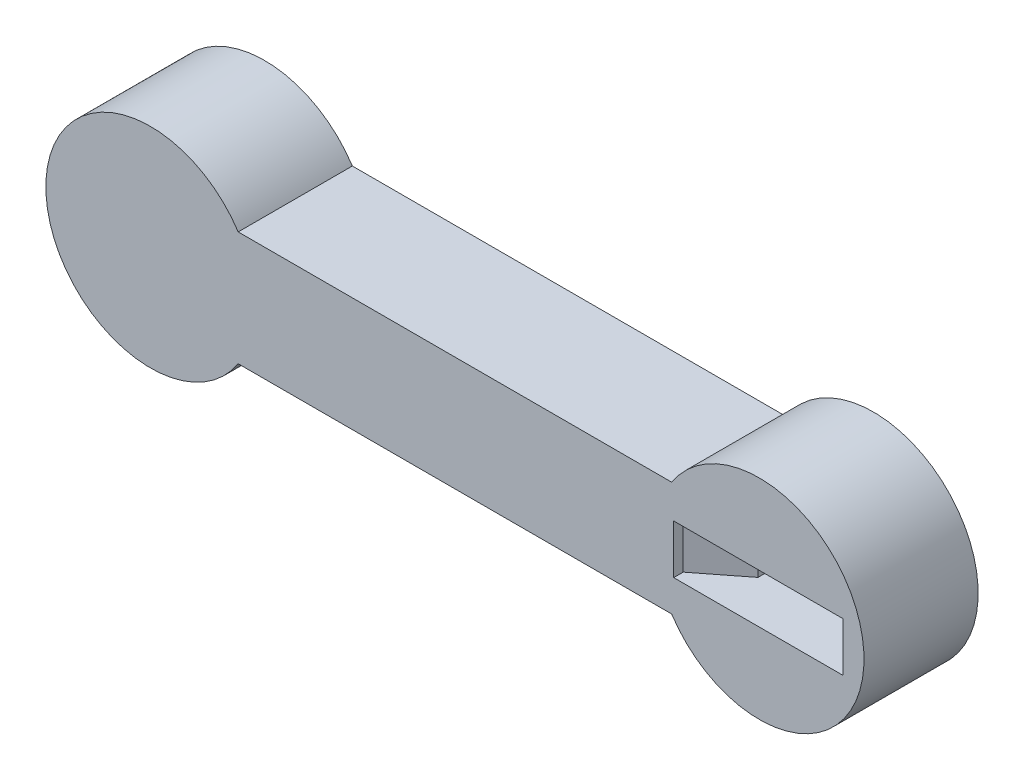
ISO-10303-21;
HEADER;
FILE_DESCRIPTION(('STEP AP214'),'2;1');
FILE_NAME('part.step','',(''),(''),'','','');
FILE_SCHEMA(('AUTOMOTIVE_DESIGN { 1 0 10303 214 1 1 1 1 }'));
ENDSEC;
DATA;
#1=APPLICATION_CONTEXT('core data for automotive mechanical design processes');
#2=APPLICATION_PROTOCOL_DEFINITION('international standard','automotive_design',2000,#1);
#3=PRODUCT_CONTEXT('',#1,'mechanical');
#4=PRODUCT('Part','Part','',(#3));
#5=PRODUCT_RELATED_PRODUCT_CATEGORY('part','',(#4));
#6=PRODUCT_DEFINITION_FORMATION('','',#4);
#7=PRODUCT_DEFINITION_CONTEXT('part definition',#1,'design');
#8=PRODUCT_DEFINITION('design','',#6,#7);
#9=PRODUCT_DEFINITION_SHAPE('','',#8);
#10=(LENGTH_UNIT() NAMED_UNIT(*) SI_UNIT(.MILLI.,.METRE.));
#11=(NAMED_UNIT(*) PLANE_ANGLE_UNIT() SI_UNIT($,.RADIAN.));
#12=(NAMED_UNIT(*) SI_UNIT($,.STERADIAN.) SOLID_ANGLE_UNIT());
#13=UNCERTAINTY_MEASURE_WITH_UNIT(LENGTH_MEASURE(1.E-05),#10,'distance_accuracy_value','');
#14=(GEOMETRIC_REPRESENTATION_CONTEXT(3) GLOBAL_UNCERTAINTY_ASSIGNED_CONTEXT((#13)) GLOBAL_UNIT_ASSIGNED_CONTEXT((#10,
#11,#12)) REPRESENTATION_CONTEXT('',''));
#15=CARTESIAN_POINT('',(0.,0.,0.));
#16=DIRECTION('',(0.,0.,1.));
#17=DIRECTION('',(1.,0.,0.));
#18=AXIS2_PLACEMENT_3D('',#15,#16,#17);
#19=CARTESIAN_POINT('',(0.,0.,30.));
#20=DIRECTION('',(0.,0.,1.));
#21=DIRECTION('',(1.,0.,0.));
#22=AXIS2_PLACEMENT_3D('',#19,#20,#21);
#23=PLANE('',#22);
#24=DIRECTION('',(-1.,0.,0.));
#25=VECTOR('',#24,1.);
#26=CARTESIAN_POINT('',(0.,6.45000000000005,30.));
#27=LINE('',#26,#25);
#28=CARTESIAN_POINT('',(181.919342789878,6.45000000000005,30.));
#29=VERTEX_POINT('',#28);
#30=CARTESIAN_POINT('',(137.49791436977,6.45,30.));
#31=VERTEX_POINT('',#30);
#32=EDGE_CURVE('E182',#29,#31,#27,.T.);
#33=ORIENTED_EDGE('',*,*,#32,.F.);
#34=DIRECTION('',(0.,-1.,0.));
#35=VECTOR('',#34,1.);
#36=CARTESIAN_POINT('',(181.919342789878,6.45000000000005,30.));
#37=LINE('',#36,#35);
#38=CARTESIAN_POINT('',(181.919342789878,-6.44999999999995,30.));
#39=VERTEX_POINT('',#38);
#40=EDGE_CURVE('E189',#29,#39,#37,.T.);
#41=ORIENTED_EDGE('',*,*,#40,.T.);
#42=DIRECTION('',(1.,0.,0.));
#43=VECTOR('',#42,1.);
#44=CARTESIAN_POINT('',(0.,-6.44999999999995,30.));
#45=LINE('',#44,#43);
#46=CARTESIAN_POINT('',(137.49791436977,-6.45,30.));
#47=VERTEX_POINT('',#46);
#48=EDGE_CURVE('E168',#47,#39,#45,.T.);
#49=ORIENTED_EDGE('',*,*,#48,.F.);
#50=DIRECTION('',(0.,-1.,0.));
#51=VECTOR('',#50,1.);
#52=CARTESIAN_POINT('',(137.49791436977,6.45,30.));
#53=LINE('',#52,#51);
#54=EDGE_CURVE('E229',#31,#47,#53,.T.);
#55=ORIENTED_EDGE('',*,*,#54,.F.);
#56=EDGE_LOOP('',(#33,#41,#49,#55));
#57=FACE_BOUND('',#56,.T.);
#58=CARTESIAN_POINT('',(0.,0.,30.));
#59=DIRECTION('',(0.,0.,1.));
#60=DIRECTION('',(1.,0.,0.));
#61=AXIS2_PLACEMENT_3D('',#58,#59,#60);
#62=CIRCLE('',#61,27.5);
#63=CARTESIAN_POINT('',(23.0488611432322,15.,30.));
#64=VERTEX_POINT('',#63);
#65=CARTESIAN_POINT('',(23.0488611432322,-15.,30.));
#66=VERTEX_POINT('',#65);
#67=EDGE_CURVE('E279',#64,#66,#62,.T.);
#68=ORIENTED_EDGE('',*,*,#67,.T.);
#69=DIRECTION('',(1.,0.,0.));
#70=VECTOR('',#69,1.);
#71=CARTESIAN_POINT('',(0.,-15.,30.));
#72=LINE('',#71,#70);
#73=CARTESIAN_POINT('',(136.951138856768,-15.,30.));
#74=VERTEX_POINT('',#73);
#75=EDGE_CURVE('E282',#66,#74,#72,.T.);
#76=ORIENTED_EDGE('',*,*,#75,.T.);
#77=CARTESIAN_POINT('',(160.,0.,30.));
#78=DIRECTION('',(0.,0.,1.));
#79=DIRECTION('',(1.,0.,0.));
#80=AXIS2_PLACEMENT_3D('',#77,#78,#79);
#81=CIRCLE('',#80,27.5);
#82=CARTESIAN_POINT('',(136.951138856768,15.,30.));
#83=VERTEX_POINT('',#82);
#84=EDGE_CURVE('E285',#74,#83,#81,.T.);
#85=ORIENTED_EDGE('',*,*,#84,.T.);
#86=DIRECTION('',(1.,0.,0.));
#87=VECTOR('',#86,1.);
#88=CARTESIAN_POINT('',(0.,15.,30.));
#89=LINE('',#88,#87);
#90=EDGE_CURVE('E287',#64,#83,#89,.T.);
#91=ORIENTED_EDGE('',*,*,#90,.F.);
#92=EDGE_LOOP('',(#68,#76,#85,#91));
#93=FACE_BOUND('',#92,.T.);
#94=ADVANCED_FACE('F43',(#57,#93),#23,.T.);
#95=CARTESIAN_POINT('',(0.,0.,4.5));
#96=DIRECTION('',(0.,0.,-1.));
#97=DIRECTION('',(-1.,0.,0.));
#98=AXIS2_PLACEMENT_3D('',#95,#96,#97);
#99=PLANE('',#98);
#100=CARTESIAN_POINT('',(151.719342789879,-8.88455975456281E-13,4.5));
#101=DIRECTION('',(0.,0.,-1.));
#102=DIRECTION('',(-1.,0.,0.));
#103=AXIS2_PLACEMENT_3D('',#100,#101,#102);
#104=CIRCLE('',#103,1.09999999999999);
#105=CARTESIAN_POINT('',(150.619342789879,-8.88455975456281E-13,4.5));
#106=VERTEX_POINT('',#105);
#107=EDGE_CURVE('E200',#106,#106,#104,.T.);
#108=ORIENTED_EDGE('',*,*,#107,.F.);
#109=EDGE_LOOP('',(#108));
#110=FACE_BOUND('',#109,.T.);
#111=DIRECTION('',(1.,0.,0.));
#112=VECTOR('',#111,1.);
#113=CARTESIAN_POINT('',(148.519342789878,6.45000000000005,4.5));
#114=LINE('',#113,#112);
#115=CARTESIAN_POINT('',(148.519342789878,6.45000000000005,4.5));
#116=VERTEX_POINT('',#115);
#117=CARTESIAN_POINT('',(153.497914369771,6.45000000000005,4.5));
#118=VERTEX_POINT('',#117);
#119=EDGE_CURVE('E250',#116,#118,#114,.T.);
#120=ORIENTED_EDGE('',*,*,#119,.T.);
#121=DIRECTION('',(0.,-1.,0.));
#122=VECTOR('',#121,1.);
#123=CARTESIAN_POINT('',(153.497914369771,0.,4.5));
#124=LINE('',#123,#122);
#125=CARTESIAN_POINT('',(153.497914369771,-6.44999999999995,4.5));
#126=VERTEX_POINT('',#125);
#127=EDGE_CURVE('E312',#118,#126,#124,.T.);
#128=ORIENTED_EDGE('',*,*,#127,.T.);
#129=DIRECTION('',(-1.,0.,0.));
#130=VECTOR('',#129,1.);
#131=CARTESIAN_POINT('',(148.519342789878,-6.44999999999995,4.5));
#132=LINE('',#131,#130);
#133=CARTESIAN_POINT('',(148.519342789878,-6.44999999999995,4.5));
#134=VERTEX_POINT('',#133);
#135=EDGE_CURVE('E256',#126,#134,#132,.T.);
#136=ORIENTED_EDGE('',*,*,#135,.T.);
#137=DIRECTION('',(0.,1.,0.));
#138=VECTOR('',#137,1.);
#139=CARTESIAN_POINT('',(148.519342789878,-6.44999999999995,4.5));
#140=LINE('',#139,#138);
#141=EDGE_CURVE('E245',#134,#116,#140,.T.);
#142=ORIENTED_EDGE('',*,*,#141,.T.);
#143=EDGE_LOOP('',(#120,#128,#136,#142));
#144=FACE_BOUND('',#143,.T.);
#145=ADVANCED_FACE('F333',(#110,#144),#99,.T.);
#146=CARTESIAN_POINT('',(0.,0.,30.));
#147=DIRECTION('',(0.,0.,-1.));
#148=DIRECTION('',(-1.,0.,0.));
#149=AXIS2_PLACEMENT_3D('',#146,#147,#148);
#150=CYLINDRICAL_SURFACE('',#149,27.5);
#151=CARTESIAN_POINT('',(0.,0.,0.));
#152=DIRECTION('',(0.,0.,1.));
#153=DIRECTION('',(1.,0.,0.));
#154=AXIS2_PLACEMENT_3D('',#151,#152,#153);
#155=CIRCLE('',#154,27.5);
#156=CARTESIAN_POINT('',(23.0488611432322,15.,0.));
#157=VERTEX_POINT('',#156);
#158=CARTESIAN_POINT('',(23.0488611432322,-15.,0.));
#159=VERTEX_POINT('',#158);
#160=EDGE_CURVE('E271',#157,#159,#155,.T.);
#161=ORIENTED_EDGE('',*,*,#160,.T.);
#162=DIRECTION('',(0.,0.,-1.));
#163=VECTOR('',#162,1.);
#164=CARTESIAN_POINT('',(23.0488611432322,-15.,30.));
#165=LINE('',#164,#163);
#166=EDGE_CURVE('E306',#66,#159,#165,.T.);
#167=ORIENTED_EDGE('',*,*,#166,.F.);
#168=ORIENTED_EDGE('',*,*,#67,.F.);
#169=DIRECTION('',(0.,0.,-1.));
#170=VECTOR('',#169,1.);
#171=CARTESIAN_POINT('',(23.0488611432322,15.,30.));
#172=LINE('',#171,#170);
#173=EDGE_CURVE('E290',#64,#157,#172,.T.);
#174=ORIENTED_EDGE('',*,*,#173,.T.);
#175=EDGE_LOOP('',(#161,#167,#168,#174));
#176=FACE_BOUND('',#175,.T.);
#177=ADVANCED_FACE('F45',(#176),#150,.T.);
#178=CARTESIAN_POINT('',(0.,-15.,30.));
#179=DIRECTION('',(0.,1.,0.));
#180=DIRECTION('',(-1.,0.,0.));
#181=AXIS2_PLACEMENT_3D('',#178,#179,#180);
#182=PLANE('',#181);
#183=DIRECTION('',(1.,0.,0.));
#184=VECTOR('',#183,1.);
#185=CARTESIAN_POINT('',(0.,-15.,0.));
#186=LINE('',#185,#184);
#187=CARTESIAN_POINT('',(136.951138856768,-15.,0.));
#188=VERTEX_POINT('',#187);
#189=EDGE_CURVE('E293',#159,#188,#186,.T.);
#190=ORIENTED_EDGE('',*,*,#189,.T.);
#191=DIRECTION('',(0.,0.,-1.));
#192=VECTOR('',#191,1.);
#193=CARTESIAN_POINT('',(136.951138856768,-15.,30.));
#194=LINE('',#193,#192);
#195=EDGE_CURVE('E303',#74,#188,#194,.T.);
#196=ORIENTED_EDGE('',*,*,#195,.F.);
#197=ORIENTED_EDGE('',*,*,#75,.F.);
#198=ORIENTED_EDGE('',*,*,#166,.T.);
#199=EDGE_LOOP('',(#190,#196,#197,#198));
#200=FACE_BOUND('',#199,.T.);
#201=ADVANCED_FACE('F404',(#200),#182,.F.);
#202=CARTESIAN_POINT('',(160.,0.,30.));
#203=DIRECTION('',(0.,0.,-1.));
#204=DIRECTION('',(-1.,0.,0.));
#205=AXIS2_PLACEMENT_3D('',#202,#203,#204);
#206=CYLINDRICAL_SURFACE('',#205,27.5);
#207=CARTESIAN_POINT('',(160.,0.,0.));
#208=DIRECTION('',(0.,0.,1.));
#209=DIRECTION('',(1.,0.,0.));
#210=AXIS2_PLACEMENT_3D('',#207,#208,#209);
#211=CIRCLE('',#210,27.5);
#212=CARTESIAN_POINT('',(136.951138856768,15.,0.));
#213=VERTEX_POINT('',#212);
#214=EDGE_CURVE('E295',#188,#213,#211,.T.);
#215=ORIENTED_EDGE('',*,*,#214,.T.);
#216=DIRECTION('',(0.,0.,-1.));
#217=VECTOR('',#216,1.);
#218=CARTESIAN_POINT('',(136.951138856768,15.,30.));
#219=LINE('',#218,#217);
#220=EDGE_CURVE('E301',#83,#213,#219,.T.);
#221=ORIENTED_EDGE('',*,*,#220,.F.);
#222=ORIENTED_EDGE('',*,*,#84,.F.);
#223=ORIENTED_EDGE('',*,*,#195,.T.);
#224=EDGE_LOOP('',(#215,#221,#222,#223));
#225=FACE_BOUND('',#224,.T.);
#226=ADVANCED_FACE('F401',(#225),#206,.T.);
#227=CARTESIAN_POINT('',(0.,15.,30.));
#228=DIRECTION('',(0.,1.,0.));
#229=DIRECTION('',(0.,0.,1.));
#230=AXIS2_PLACEMENT_3D('',#227,#228,#229);
#231=PLANE('',#230);
#232=DIRECTION('',(1.,0.,0.));
#233=VECTOR('',#232,1.);
#234=CARTESIAN_POINT('',(0.,15.,0.));
#235=LINE('',#234,#233);
#236=EDGE_CURVE('E283',#157,#213,#235,.T.);
#237=ORIENTED_EDGE('',*,*,#236,.F.);
#238=ORIENTED_EDGE('',*,*,#173,.F.);
#239=ORIENTED_EDGE('',*,*,#90,.T.);
#240=ORIENTED_EDGE('',*,*,#220,.T.);
#241=EDGE_LOOP('',(#237,#238,#239,#240));
#242=FACE_BOUND('',#241,.T.);
#243=ADVANCED_FACE('F397',(#242),#231,.T.);
#244=CARTESIAN_POINT('',(0.,0.,0.));
#245=DIRECTION('',(0.,0.,1.));
#246=DIRECTION('',(1.,0.,0.));
#247=AXIS2_PLACEMENT_3D('',#244,#245,#246);
#248=PLANE('',#247);
#249=CARTESIAN_POINT('',(0.,0.,0.));
#250=DIRECTION('',(0.,0.,-1.));
#251=DIRECTION('',(-1.,0.,0.));
#252=AXIS2_PLACEMENT_3D('',#249,#250,#251);
#253=CIRCLE('',#252,20.0000000000004);
#254=CARTESIAN_POINT('',(-20.0000000000004,0.,0.));
#255=VERTEX_POINT('',#254);
#256=EDGE_CURVE('E216',#255,#255,#253,.T.);
#257=ORIENTED_EDGE('',*,*,#256,.F.);
#258=EDGE_LOOP('',(#257));
#259=FACE_BOUND('',#258,.T.);
#260=DIRECTION('',(1.,0.,0.));
#261=VECTOR('',#260,1.);
#262=CARTESIAN_POINT('',(148.519342789878,6.45000000000005,0.));
#263=LINE('',#262,#261);
#264=CARTESIAN_POINT('',(148.519342789878,6.45000000000005,0.));
#265=VERTEX_POINT('',#264);
#266=CARTESIAN_POINT('',(181.919342789878,6.45000000000005,0.));
#267=VERTEX_POINT('',#266);
#268=EDGE_CURVE('E262',#265,#267,#263,.T.);
#269=ORIENTED_EDGE('',*,*,#268,.F.);
#270=DIRECTION('',(0.,1.,0.));
#271=VECTOR('',#270,1.);
#272=CARTESIAN_POINT('',(148.519342789878,-6.44999999999995,0.));
#273=LINE('',#272,#271);
#274=CARTESIAN_POINT('',(148.519342789878,-6.44999999999995,0.));
#275=VERTEX_POINT('',#274);
#276=EDGE_CURVE('E239',#275,#265,#273,.T.);
#277=ORIENTED_EDGE('',*,*,#276,.F.);
#278=DIRECTION('',(-1.,0.,0.));
#279=VECTOR('',#278,1.);
#280=CARTESIAN_POINT('',(148.519342789878,-6.44999999999995,0.));
#281=LINE('',#280,#279);
#282=CARTESIAN_POINT('',(181.919342789878,-6.44999999999995,0.));
#283=VERTEX_POINT('',#282);
#284=EDGE_CURVE('E249',#283,#275,#281,.T.);
#285=ORIENTED_EDGE('',*,*,#284,.F.);
#286=DIRECTION('',(0.,-1.,0.));
#287=VECTOR('',#286,1.);
#288=CARTESIAN_POINT('',(181.919342789878,-6.44999999999995,0.));
#289=LINE('',#288,#287);
#290=EDGE_CURVE('E264',#267,#283,#289,.T.);
#291=ORIENTED_EDGE('',*,*,#290,.F.);
#292=EDGE_LOOP('',(#269,#277,#285,#291));
#293=FACE_BOUND('',#292,.T.);
#294=ORIENTED_EDGE('',*,*,#160,.F.);
#295=ORIENTED_EDGE('',*,*,#236,.T.);
#296=ORIENTED_EDGE('',*,*,#214,.F.);
#297=ORIENTED_EDGE('',*,*,#189,.F.);
#298=EDGE_LOOP('',(#294,#295,#296,#297));
#299=FACE_BOUND('',#298,.T.);
#300=ADVANCED_FACE('F358',(#259,#293,#299),#248,.F.);
#301=CARTESIAN_POINT('',(148.519342789878,-6.44999999999995,4.5));
#302=DIRECTION('',(-1.,0.,0.));
#303=DIRECTION('',(0.,0.,1.));
#304=AXIS2_PLACEMENT_3D('',#301,#302,#303);
#305=PLANE('',#304);
#306=ORIENTED_EDGE('',*,*,#276,.T.);
#307=DIRECTION('',(0.,0.,-1.));
#308=VECTOR('',#307,1.);
#309=CARTESIAN_POINT('',(148.519342789878,6.45000000000005,4.5));
#310=LINE('',#309,#308);
#311=EDGE_CURVE('E260',#116,#265,#310,.T.);
#312=ORIENTED_EDGE('',*,*,#311,.F.);
#313=ORIENTED_EDGE('',*,*,#141,.F.);
#314=DIRECTION('',(0.,0.,-1.));
#315=VECTOR('',#314,1.);
#316=CARTESIAN_POINT('',(148.519342789878,-6.44999999999995,4.5));
#317=LINE('',#316,#315);
#318=EDGE_CURVE('E268',#134,#275,#317,.T.);
#319=ORIENTED_EDGE('',*,*,#318,.T.);
#320=EDGE_LOOP('',(#306,#312,#313,#319));
#321=FACE_BOUND('',#320,.T.);
#322=ADVANCED_FACE('F356',(#321),#305,.F.);
#323=CARTESIAN_POINT('',(148.519342789878,-6.44999999999995,4.5));
#324=DIRECTION('',(0.,-1.,0.));
#325=DIRECTION('',(0.,0.,-1.));
#326=AXIS2_PLACEMENT_3D('',#323,#324,#325);
#327=PLANE('',#326);
#328=DIRECTION('',(0.,0.,-1.));
#329=VECTOR('',#328,1.);
#330=CARTESIAN_POINT('',(153.497914369771,-6.44999999999995,30.));
#331=LINE('',#330,#329);
#332=CARTESIAN_POINT('',(153.497914369771,-6.44999999999995,6.5));
#333=VERTEX_POINT('',#332);
#334=EDGE_CURVE('E237',#333,#126,#331,.T.);
#335=ORIENTED_EDGE('',*,*,#334,.F.);
#336=DIRECTION('',(-1.,0.,0.));
#337=VECTOR('',#336,1.);
#338=CARTESIAN_POINT('',(181.919342789878,-6.44999999999995,6.5));
#339=LINE('',#338,#337);
#340=CARTESIAN_POINT('',(148.519342789878,-6.44999999999995,6.5));
#341=VERTEX_POINT('',#340);
#342=EDGE_CURVE('E203',#333,#341,#339,.T.);
#343=ORIENTED_EDGE('',*,*,#342,.T.);
#344=DIRECTION('',(0.,0.,-1.));
#345=VECTOR('',#344,1.);
#346=CARTESIAN_POINT('',(148.519342789878,-6.44999999999995,30.));
#347=LINE('',#346,#345);
#348=CARTESIAN_POINT('',(148.519342789878,-6.45,18.8895090467903));
#349=VERTEX_POINT('',#348);
#350=EDGE_CURVE('E67',#349,#341,#347,.T.);
#351=ORIENTED_EDGE('',*,*,#350,.F.);
#352=DIRECTION('',(0.788024373724564,0.,-0.615644041972314));
#353=VECTOR('',#352,1.);
#354=CARTESIAN_POINT('',(65.4555466835088,-6.45,83.7830997548915));
#355=LINE('',#354,#353);
#356=CARTESIAN_POINT('',(137.49791436977,-6.45,27.5));
#357=VERTEX_POINT('',#356);
#358=EDGE_CURVE('E226',#357,#349,#355,.T.);
#359=ORIENTED_EDGE('',*,*,#358,.F.);
#360=DIRECTION('',(0.,0.,-1.));
#361=VECTOR('',#360,1.);
#362=CARTESIAN_POINT('',(137.49791436977,-6.45,-1.52653350371257E-12));
#363=LINE('',#362,#361);
#364=EDGE_CURVE('E176',#47,#357,#363,.T.);
#365=ORIENTED_EDGE('',*,*,#364,.F.);
#366=ORIENTED_EDGE('',*,*,#48,.T.);
#367=DIRECTION('',(0.,0.,-1.));
#368=VECTOR('',#367,1.);
#369=CARTESIAN_POINT('',(181.919342789878,-6.44999999999995,30.));
#370=LINE('',#369,#368);
#371=CARTESIAN_POINT('',(181.919342789878,-6.44999999999995,6.5));
#372=VERTEX_POINT('',#371);
#373=EDGE_CURVE('E173',#39,#372,#370,.T.);
#374=ORIENTED_EDGE('',*,*,#373,.T.);
#375=CARTESIAN_POINT('',(176.95,-6.44999999999995,6.5));
#376=VERTEX_POINT('',#375);
#377=EDGE_CURVE('E204',#372,#376,#339,.T.);
#378=ORIENTED_EDGE('',*,*,#377,.T.);
#379=DIRECTION('',(0.,0.,-1.));
#380=VECTOR('',#379,1.);
#381=CARTESIAN_POINT('',(176.95,-6.44999999999995,30.));
#382=LINE('',#381,#380);
#383=CARTESIAN_POINT('',(176.95,-6.44999999999995,4.5));
#384=VERTEX_POINT('',#383);
#385=EDGE_CURVE('E240',#376,#384,#382,.T.);
#386=ORIENTED_EDGE('',*,*,#385,.T.);
#387=CARTESIAN_POINT('',(181.919342789878,-6.44999999999995,4.5));
#388=VERTEX_POINT('',#387);
#389=EDGE_CURVE('E257',#388,#384,#132,.T.);
#390=ORIENTED_EDGE('',*,*,#389,.F.);
#391=DIRECTION('',(0.,0.,-1.));
#392=VECTOR('',#391,1.);
#393=CARTESIAN_POINT('',(181.919342789878,-6.44999999999995,4.5));
#394=LINE('',#393,#392);
#395=EDGE_CURVE('E272',#388,#283,#394,.T.);
#396=ORIENTED_EDGE('',*,*,#395,.T.);
#397=ORIENTED_EDGE('',*,*,#284,.T.);
#398=ORIENTED_EDGE('',*,*,#318,.F.);
#399=ORIENTED_EDGE('',*,*,#135,.F.);
#400=EDGE_LOOP('',(#335,#343,#351,#359,#365,#366,#374,#378,#386,#390,#396,#397,#398,#399));
#401=FACE_BOUND('',#400,.T.);
#402=ADVANCED_FACE('F171',(#401),#327,.F.);
#403=CARTESIAN_POINT('',(181.919342789878,-6.44999999999995,4.5));
#404=DIRECTION('',(1.,0.,0.));
#405=DIRECTION('',(0.,0.,-1.));
#406=AXIS2_PLACEMENT_3D('',#403,#404,#405);
#407=PLANE('',#406);
#408=ORIENTED_EDGE('',*,*,#290,.T.);
#409=ORIENTED_EDGE('',*,*,#395,.F.);
#410=DIRECTION('',(0.,-1.,0.));
#411=VECTOR('',#410,1.);
#412=CARTESIAN_POINT('',(181.919342789878,-6.44999999999995,4.5));
#413=LINE('',#412,#411);
#414=CARTESIAN_POINT('',(181.919342789878,6.45000000000005,4.5));
#415=VERTEX_POINT('',#414);
#416=EDGE_CURVE('E253',#415,#388,#413,.T.);
#417=ORIENTED_EDGE('',*,*,#416,.F.);
#418=DIRECTION('',(0.,0.,-1.));
#419=VECTOR('',#418,1.);
#420=CARTESIAN_POINT('',(181.919342789878,6.45000000000005,4.5));
#421=LINE('',#420,#419);
#422=EDGE_CURVE('E274',#415,#267,#421,.T.);
#423=ORIENTED_EDGE('',*,*,#422,.T.);
#424=EDGE_LOOP('',(#408,#409,#417,#423));
#425=FACE_BOUND('',#424,.T.);
#426=ADVANCED_FACE('F365',(#425),#407,.F.);
#427=CARTESIAN_POINT('',(148.519342789878,6.45000000000005,4.5));
#428=DIRECTION('',(0.,1.,0.));
#429=DIRECTION('',(0.,0.,1.));
#430=AXIS2_PLACEMENT_3D('',#427,#428,#429);
#431=PLANE('',#430);
#432=DIRECTION('',(0.,0.,-1.));
#433=VECTOR('',#432,1.);
#434=CARTESIAN_POINT('',(176.95,6.45000000000005,30.));
#435=LINE('',#434,#433);
#436=CARTESIAN_POINT('',(176.95,6.45000000000005,6.5));
#437=VERTEX_POINT('',#436);
#438=CARTESIAN_POINT('',(176.95,6.45000000000005,4.5));
#439=VERTEX_POINT('',#438);
#440=EDGE_CURVE('E242',#437,#439,#435,.T.);
#441=ORIENTED_EDGE('',*,*,#440,.F.);
#442=DIRECTION('',(1.,0.,0.));
#443=VECTOR('',#442,1.);
#444=CARTESIAN_POINT('',(181.919342789878,6.45000000000005,6.5));
#445=LINE('',#444,#443);
#446=CARTESIAN_POINT('',(181.919342789878,6.45000000000005,6.5));
#447=VERTEX_POINT('',#446);
#448=EDGE_CURVE('E60',#437,#447,#445,.T.);
#449=ORIENTED_EDGE('',*,*,#448,.T.);
#450=DIRECTION('',(0.,0.,-1.));
#451=VECTOR('',#450,1.);
#452=CARTESIAN_POINT('',(181.919342789878,6.45000000000005,30.));
#453=LINE('',#452,#451);
#454=EDGE_CURVE('E209',#29,#447,#453,.T.);
#455=ORIENTED_EDGE('',*,*,#454,.F.);
#456=ORIENTED_EDGE('',*,*,#32,.T.);
#457=DIRECTION('',(0.,0.,-1.));
#458=VECTOR('',#457,1.);
#459=CARTESIAN_POINT('',(137.49791436977,6.45,-1.52653350371257E-12));
#460=LINE('',#459,#458);
#461=CARTESIAN_POINT('',(137.49791436977,6.45,27.5));
#462=VERTEX_POINT('',#461);
#463=EDGE_CURVE('E222',#31,#462,#460,.T.);
#464=ORIENTED_EDGE('',*,*,#463,.T.);
#465=DIRECTION('',(0.788024373724564,0.,-0.615644041972314));
#466=VECTOR('',#465,1.);
#467=CARTESIAN_POINT('',(65.4555466835088,6.45,83.7830997548915));
#468=LINE('',#467,#466);
#469=CARTESIAN_POINT('',(148.519342789878,6.45000000000005,18.8895090467903));
#470=VERTEX_POINT('',#469);
#471=EDGE_CURVE('E225',#462,#470,#468,.T.);
#472=ORIENTED_EDGE('',*,*,#471,.T.);
#473=DIRECTION('',(0.,0.,-1.));
#474=VECTOR('',#473,1.);
#475=CARTESIAN_POINT('',(148.519342789878,6.45000000000005,30.));
#476=LINE('',#475,#474);
#477=CARTESIAN_POINT('',(148.519342789878,6.45000000000005,6.5));
#478=VERTEX_POINT('',#477);
#479=EDGE_CURVE('E212',#470,#478,#476,.T.);
#480=ORIENTED_EDGE('',*,*,#479,.T.);
#481=CARTESIAN_POINT('',(153.497914369771,6.45000000000005,6.5));
#482=VERTEX_POINT('',#481);
#483=EDGE_CURVE('E194',#478,#482,#445,.T.);
#484=ORIENTED_EDGE('',*,*,#483,.T.);
#485=DIRECTION('',(0.,0.,-1.));
#486=VECTOR('',#485,1.);
#487=CARTESIAN_POINT('',(153.497914369771,6.45000000000005,30.));
#488=LINE('',#487,#486);
#489=EDGE_CURVE('E181',#482,#118,#488,.T.);
#490=ORIENTED_EDGE('',*,*,#489,.T.);
#491=ORIENTED_EDGE('',*,*,#119,.F.);
#492=ORIENTED_EDGE('',*,*,#311,.T.);
#493=ORIENTED_EDGE('',*,*,#268,.T.);
#494=ORIENTED_EDGE('',*,*,#422,.F.);
#495=EDGE_CURVE('E248',#439,#415,#114,.T.);
#496=ORIENTED_EDGE('',*,*,#495,.F.);
#497=EDGE_LOOP('',(#441,#449,#455,#456,#464,#472,#480,#484,#490,#491,#492,#493,#494,#496));
#498=FACE_BOUND('',#497,.T.);
#499=ADVANCED_FACE('F344',(#498),#431,.F.);
#500=CARTESIAN_POINT('',(178.719342789879,-8.80961970040062E-13,4.5));
#501=DIRECTION('',(0.,0.,-1.));
#502=DIRECTION('',(-1.,0.,0.));
#503=AXIS2_PLACEMENT_3D('',#500,#501,#502);
#504=CIRCLE('',#503,1.09999999999999);
#505=CARTESIAN_POINT('',(177.619342789879,-8.80961970040062E-13,4.5));
#506=VERTEX_POINT('',#505);
#507=EDGE_CURVE('E318',#506,#506,#504,.T.);
#508=ORIENTED_EDGE('',*,*,#507,.F.);
#509=EDGE_LOOP('',(#508));
#510=FACE_BOUND('',#509,.T.);
#511=DIRECTION('',(0.,-1.,0.));
#512=VECTOR('',#511,1.);
#513=CARTESIAN_POINT('',(176.95,0.,4.5));
#514=LINE('',#513,#512);
#515=EDGE_CURVE('E309',#439,#384,#514,.T.);
#516=ORIENTED_EDGE('',*,*,#515,.F.);
#517=ORIENTED_EDGE('',*,*,#495,.T.);
#518=ORIENTED_EDGE('',*,*,#416,.T.);
#519=ORIENTED_EDGE('',*,*,#389,.T.);
#520=EDGE_LOOP('',(#516,#517,#518,#519));
#521=FACE_BOUND('',#520,.T.);
#522=ADVANCED_FACE('F337',(#510,#521),#99,.T.);
#523=CARTESIAN_POINT('',(153.497914369771,0.,30.));
#524=DIRECTION('',(1.,0.,0.));
#525=DIRECTION('',(0.,0.,-1.));
#526=AXIS2_PLACEMENT_3D('',#523,#524,#525);
#527=PLANE('',#526);
#528=DIRECTION('',(0.,1.,0.));
#529=VECTOR('',#528,1.);
#530=CARTESIAN_POINT('',(153.497914369771,0.,6.5));
#531=LINE('',#530,#529);
#532=EDGE_CURVE('E211',#333,#482,#531,.T.);
#533=ORIENTED_EDGE('',*,*,#532,.F.);
#534=ORIENTED_EDGE('',*,*,#334,.T.);
#535=ORIENTED_EDGE('',*,*,#127,.F.);
#536=ORIENTED_EDGE('',*,*,#489,.F.);
#537=EDGE_LOOP('',(#533,#534,#535,#536));
#538=FACE_BOUND('',#537,.T.);
#539=ADVANCED_FACE('F350',(#538),#527,.T.);
#540=CARTESIAN_POINT('',(176.95,0.,30.));
#541=DIRECTION('',(1.,0.,0.));
#542=DIRECTION('',(0.,0.,-1.));
#543=AXIS2_PLACEMENT_3D('',#540,#541,#542);
#544=PLANE('',#543);
#545=ORIENTED_EDGE('',*,*,#385,.F.);
#546=DIRECTION('',(0.,1.,0.));
#547=VECTOR('',#546,1.);
#548=CARTESIAN_POINT('',(176.95,0.,6.5));
#549=LINE('',#548,#547);
#550=EDGE_CURVE('E11',#376,#437,#549,.T.);
#551=ORIENTED_EDGE('',*,*,#550,.T.);
#552=ORIENTED_EDGE('',*,*,#440,.T.);
#553=ORIENTED_EDGE('',*,*,#515,.T.);
#554=EDGE_LOOP('',(#545,#551,#552,#553));
#555=FACE_BOUND('',#554,.T.);
#556=ADVANCED_FACE('F371',(#555),#544,.F.);
#557=CARTESIAN_POINT('',(65.4555466835088,6.45,83.7830997548915));
#558=DIRECTION('',(-0.615644041972314,0.,-0.788024373724564));
#559=DIRECTION('',(-0.788024373724564,0.,0.615644041972314));
#560=AXIS2_PLACEMENT_3D('',#557,#558,#559);
#561=PLANE('',#560);
#562=ORIENTED_EDGE('',*,*,#358,.T.);
#563=DIRECTION('',(0.,1.,0.));
#564=VECTOR('',#563,1.);
#565=CARTESIAN_POINT('',(148.519342789878,6.45,18.8895090467903));
#566=LINE('',#565,#564);
#567=EDGE_CURVE('E52',#349,#470,#566,.T.);
#568=ORIENTED_EDGE('',*,*,#567,.T.);
#569=ORIENTED_EDGE('',*,*,#471,.F.);
#570=DIRECTION('',(0.,-1.,0.));
#571=VECTOR('',#570,1.);
#572=CARTESIAN_POINT('',(137.49791436977,6.45,27.5));
#573=LINE('',#572,#571);
#574=EDGE_CURVE('E233',#462,#357,#573,.T.);
#575=ORIENTED_EDGE('',*,*,#574,.T.);
#576=EDGE_LOOP('',(#562,#568,#569,#575));
#577=FACE_BOUND('',#576,.T.);
#578=ADVANCED_FACE('F525',(#577),#561,.F.);
#579=CARTESIAN_POINT('',(137.49791436977,6.45,-1.52653350371257E-12));
#580=DIRECTION('',(-1.,0.,0.));
#581=DIRECTION('',(0.,0.,1.));
#582=AXIS2_PLACEMENT_3D('',#579,#580,#581);
#583=PLANE('',#582);
#584=ORIENTED_EDGE('',*,*,#364,.T.);
#585=ORIENTED_EDGE('',*,*,#574,.F.);
#586=ORIENTED_EDGE('',*,*,#463,.F.);
#587=ORIENTED_EDGE('',*,*,#54,.T.);
#588=EDGE_LOOP('',(#584,#585,#586,#587));
#589=FACE_BOUND('',#588,.T.);
#590=ADVANCED_FACE('F529',(#589),#583,.F.);
#591=CARTESIAN_POINT('',(0.,0.,8.8));
#592=DIRECTION('',(0.,0.,-1.));
#593=DIRECTION('',(-1.,0.,0.));
#594=AXIS2_PLACEMENT_3D('',#591,#592,#593);
#595=CYLINDRICAL_SURFACE('',#594,20.0000000000004);
#596=CARTESIAN_POINT('',(0.,0.,8.8));
#597=DIRECTION('',(0.,0.,-1.));
#598=DIRECTION('',(-1.,0.,0.));
#599=AXIS2_PLACEMENT_3D('',#596,#597,#598);
#600=CIRCLE('',#599,20.0000000000004);
#601=CARTESIAN_POINT('',(-20.0000000000004,0.,8.8));
#602=VERTEX_POINT('',#601);
#603=EDGE_CURVE('E217',#602,#602,#600,.T.);
#604=ORIENTED_EDGE('',*,*,#603,.F.);
#605=EDGE_LOOP('',(#604));
#606=FACE_BOUND('',#605,.T.);
#607=ORIENTED_EDGE('',*,*,#256,.T.);
#608=EDGE_LOOP('',(#607));
#609=FACE_BOUND('',#608,.T.);
#610=ADVANCED_FACE('F566',(#606,#609),#595,.F.);
#611=CARTESIAN_POINT('',(0.,0.,8.8));
#612=DIRECTION('',(0.,0.,-1.));
#613=DIRECTION('',(-1.,0.,0.));
#614=AXIS2_PLACEMENT_3D('',#611,#612,#613);
#615=PLANE('',#614);
#616=ORIENTED_EDGE('',*,*,#603,.T.);
#617=EDGE_LOOP('',(#616));
#618=FACE_BOUND('',#617,.T.);
#619=ADVANCED_FACE('F518',(#618),#615,.T.);
#620=CARTESIAN_POINT('',(148.519342789878,6.45000000000005,30.));
#621=DIRECTION('',(-1.,0.,0.));
#622=DIRECTION('',(0.,0.,1.));
#623=AXIS2_PLACEMENT_3D('',#620,#621,#622);
#624=PLANE('',#623);
#625=ORIENTED_EDGE('',*,*,#350,.T.);
#626=DIRECTION('',(0.,1.,0.));
#627=VECTOR('',#626,1.);
#628=CARTESIAN_POINT('',(148.519342789878,6.45000000000005,6.5));
#629=LINE('',#628,#627);
#630=EDGE_CURVE('E206',#341,#478,#629,.T.);
#631=ORIENTED_EDGE('',*,*,#630,.T.);
#632=ORIENTED_EDGE('',*,*,#479,.F.);
#633=ORIENTED_EDGE('',*,*,#567,.F.);
#634=EDGE_LOOP('',(#625,#631,#632,#633));
#635=FACE_BOUND('',#634,.T.);
#636=ADVANCED_FACE('F383',(#635),#624,.F.);
#637=CARTESIAN_POINT('',(0.,0.,6.5));
#638=DIRECTION('',(0.,0.,-1.));
#639=DIRECTION('',(-1.,0.,0.));
#640=AXIS2_PLACEMENT_3D('',#637,#638,#639);
#641=PLANE('',#640);
#642=CARTESIAN_POINT('',(151.719342789879,-8.88455975456281E-13,6.5));
#643=DIRECTION('',(0.,0.,-1.));
#644=DIRECTION('',(-1.,0.,0.));
#645=AXIS2_PLACEMENT_3D('',#642,#643,#644);
#646=CIRCLE('',#645,1.09999999999999);
#647=CARTESIAN_POINT('',(150.619342789879,-8.88455975456281E-13,6.5));
#648=VERTEX_POINT('',#647);
#649=EDGE_CURVE('E47',#648,#648,#646,.T.);
#650=ORIENTED_EDGE('',*,*,#649,.T.);
#651=EDGE_LOOP('',(#650));
#652=FACE_BOUND('',#651,.T.);
#653=ORIENTED_EDGE('',*,*,#532,.T.);
#654=ORIENTED_EDGE('',*,*,#483,.F.);
#655=ORIENTED_EDGE('',*,*,#630,.F.);
#656=ORIENTED_EDGE('',*,*,#342,.F.);
#657=EDGE_LOOP('',(#653,#654,#655,#656));
#658=FACE_BOUND('',#657,.T.);
#659=ADVANCED_FACE('F374',(#652,#658),#641,.F.);
#660=CARTESIAN_POINT('',(178.719342789879,-8.80961970040062E-13,6.5));
#661=DIRECTION('',(0.,0.,-1.));
#662=DIRECTION('',(-1.,0.,0.));
#663=AXIS2_PLACEMENT_3D('',#660,#661,#662);
#664=CIRCLE('',#663,1.09999999999999);
#665=CARTESIAN_POINT('',(177.619342789879,-8.80961970040062E-13,6.5));
#666=VERTEX_POINT('',#665);
#667=EDGE_CURVE('E316',#666,#666,#664,.T.);
#668=ORIENTED_EDGE('',*,*,#667,.T.);
#669=EDGE_LOOP('',(#668));
#670=FACE_BOUND('',#669,.T.);
#671=ORIENTED_EDGE('',*,*,#377,.F.);
#672=DIRECTION('',(0.,-1.,0.));
#673=VECTOR('',#672,1.);
#674=CARTESIAN_POINT('',(181.919342789878,6.45000000000005,6.5));
#675=LINE('',#674,#673);
#676=EDGE_CURVE('E190',#447,#372,#675,.T.);
#677=ORIENTED_EDGE('',*,*,#676,.F.);
#678=ORIENTED_EDGE('',*,*,#448,.F.);
#679=ORIENTED_EDGE('',*,*,#550,.F.);
#680=EDGE_LOOP('',(#671,#677,#678,#679));
#681=FACE_BOUND('',#680,.T.);
#682=ADVANCED_FACE('F372',(#670,#681),#641,.F.);
#683=CARTESIAN_POINT('',(181.919342789878,6.45000000000005,30.));
#684=DIRECTION('',(1.,0.,0.));
#685=DIRECTION('',(0.,0.,-1.));
#686=AXIS2_PLACEMENT_3D('',#683,#684,#685);
#687=PLANE('',#686);
#688=ORIENTED_EDGE('',*,*,#676,.T.);
#689=ORIENTED_EDGE('',*,*,#373,.F.);
#690=ORIENTED_EDGE('',*,*,#40,.F.);
#691=ORIENTED_EDGE('',*,*,#454,.T.);
#692=EDGE_LOOP('',(#688,#689,#690,#691));
#693=FACE_BOUND('',#692,.T.);
#694=ADVANCED_FACE('F187',(#693),#687,.F.);
#695=CARTESIAN_POINT('',(178.719342789879,-8.80961970040062E-13,30.));
#696=DIRECTION('',(0.,0.,-1.));
#697=DIRECTION('',(-1.,0.,0.));
#698=AXIS2_PLACEMENT_3D('',#695,#696,#697);
#699=CYLINDRICAL_SURFACE('',#698,1.09999999999999);
#700=ORIENTED_EDGE('',*,*,#507,.T.);
#701=EDGE_LOOP('',(#700));
#702=FACE_BOUND('',#701,.T.);
#703=ORIENTED_EDGE('',*,*,#667,.F.);
#704=EDGE_LOOP('',(#703));
#705=FACE_BOUND('',#704,.T.);
#706=ADVANCED_FACE('F381',(#702,#705),#699,.F.);
#707=CARTESIAN_POINT('',(151.719342789879,-8.88455975456281E-13,30.));
#708=DIRECTION('',(0.,0.,-1.));
#709=DIRECTION('',(-1.,0.,0.));
#710=AXIS2_PLACEMENT_3D('',#707,#708,#709);
#711=CYLINDRICAL_SURFACE('',#710,1.09999999999999);
#712=ORIENTED_EDGE('',*,*,#107,.T.);
#713=EDGE_LOOP('',(#712));
#714=FACE_BOUND('',#713,.T.);
#715=ORIENTED_EDGE('',*,*,#649,.F.);
#716=EDGE_LOOP('',(#715));
#717=FACE_BOUND('',#716,.T.);
#718=ADVANCED_FACE('F330',(#714,#717),#711,.F.);
#719=CLOSED_SHELL('',(#94,#145,#177,#201,#226,#243,#300,#322,#402,#426,#499,#522,#539,#556,#578,
#590,#610,#619,#636,#659,#682,#694,#706,#718));
#720=MANIFOLD_SOLID_BREP('B2',#719);
#721=ADVANCED_BREP_SHAPE_REPRESENTATION('',(#18,#720),#14);
#722=SHAPE_DEFINITION_REPRESENTATION(#9,#721);
ENDSEC;
END-ISO-10303-21;
